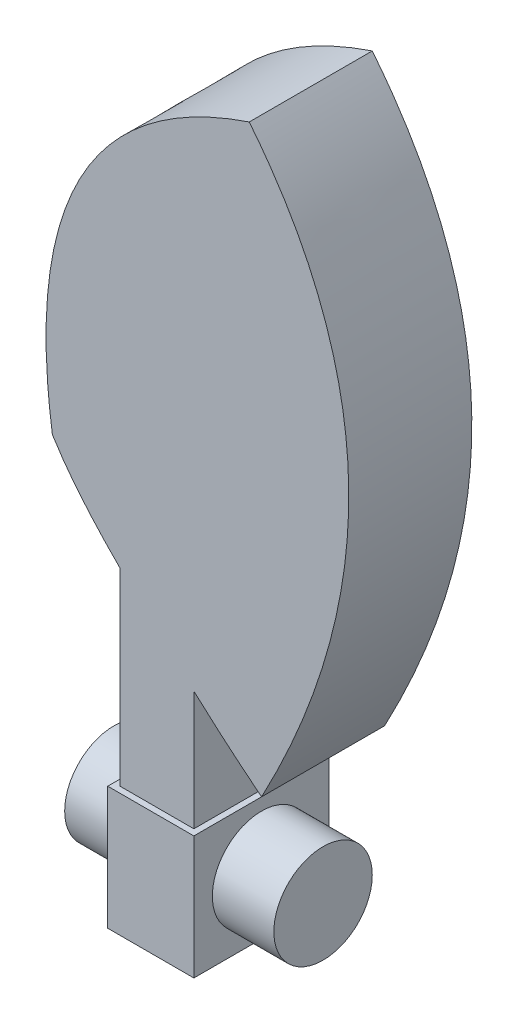
ISO-10303-21;
HEADER;
FILE_DESCRIPTION(('STEP AP214'),'2;1');
FILE_NAME('part.step','',(''),(''),'','','');
FILE_SCHEMA(('AUTOMOTIVE_DESIGN { 1 0 10303 214 1 1 1 1 }'));
ENDSEC;
DATA;
#1=APPLICATION_CONTEXT('core data for automotive mechanical design processes');
#2=APPLICATION_PROTOCOL_DEFINITION('international standard','automotive_design',2000,#1);
#3=PRODUCT_CONTEXT('',#1,'mechanical');
#4=PRODUCT('Part','Part','',(#3));
#5=PRODUCT_RELATED_PRODUCT_CATEGORY('part','',(#4));
#6=PRODUCT_DEFINITION_FORMATION('','',#4);
#7=PRODUCT_DEFINITION_CONTEXT('part definition',#1,'design');
#8=PRODUCT_DEFINITION('design','',#6,#7);
#9=PRODUCT_DEFINITION_SHAPE('','',#8);
#10=(LENGTH_UNIT() NAMED_UNIT(*) SI_UNIT(.MILLI.,.METRE.));
#11=(NAMED_UNIT(*) PLANE_ANGLE_UNIT() SI_UNIT($,.RADIAN.));
#12=(NAMED_UNIT(*) SI_UNIT($,.STERADIAN.) SOLID_ANGLE_UNIT());
#13=UNCERTAINTY_MEASURE_WITH_UNIT(LENGTH_MEASURE(1.E-05),#10,'distance_accuracy_value','');
#14=(GEOMETRIC_REPRESENTATION_CONTEXT(3) GLOBAL_UNCERTAINTY_ASSIGNED_CONTEXT((#13)) GLOBAL_UNIT_ASSIGNED_CONTEXT((#10,
#11,#12)) REPRESENTATION_CONTEXT('',''));
#15=CARTESIAN_POINT('',(0.,0.,0.));
#16=DIRECTION('',(0.,0.,1.));
#17=DIRECTION('',(1.,0.,0.));
#18=AXIS2_PLACEMENT_3D('',#15,#16,#17);
#19=CARTESIAN_POINT('',(0.,-22.,0.));
#20=DIRECTION('',(0.,1.,0.));
#21=DIRECTION('',(0.,0.,1.));
#22=AXIS2_PLACEMENT_3D('',#19,#20,#21);
#23=PLANE('',#22);
#24=DIRECTION('',(0.,0.,1.));
#25=VECTOR('',#24,1.);
#26=CARTESIAN_POINT('',(5.,-22.,10.5));
#27=LINE('',#26,#25);
#28=CARTESIAN_POINT('',(5.,-22.,-0.500000000000001));
#29=VERTEX_POINT('',#28);
#30=CARTESIAN_POINT('',(5.,-22.,10.5));
#31=VERTEX_POINT('',#30);
#32=EDGE_CURVE('E112',#29,#31,#27,.T.);
#33=ORIENTED_EDGE('',*,*,#32,.T.);
#34=DIRECTION('',(1.,0.,0.));
#35=VECTOR('',#34,1.);
#36=CARTESIAN_POINT('',(5.,-22.,10.5));
#37=LINE('',#36,#35);
#38=CARTESIAN_POINT('',(11.9999999936919,-22.,10.5));
#39=VERTEX_POINT('',#38);
#40=EDGE_CURVE('E82',#31,#39,#37,.T.);
#41=ORIENTED_EDGE('',*,*,#40,.T.);
#42=DIRECTION('',(0.,0.,-1.));
#43=VECTOR('',#42,1.);
#44=CARTESIAN_POINT('',(11.9999999936919,-22.,10.5));
#45=LINE('',#44,#43);
#46=CARTESIAN_POINT('',(11.9999999936919,-22.,-0.5));
#47=VERTEX_POINT('',#46);
#48=EDGE_CURVE('E120',#39,#47,#45,.T.);
#49=ORIENTED_EDGE('',*,*,#48,.T.);
#50=DIRECTION('',(-1.,0.,0.));
#51=VECTOR('',#50,1.);
#52=CARTESIAN_POINT('',(5.,-22.,-0.500000000000001));
#53=LINE('',#52,#51);
#54=EDGE_CURVE('E106',#47,#29,#53,.T.);
#55=ORIENTED_EDGE('',*,*,#54,.T.);
#56=EDGE_LOOP('',(#33,#41,#49,#55));
#57=FACE_BOUND('',#56,.T.);
#58=ADVANCED_FACE('F50',(#57),#23,.T.);
#59=CARTESIAN_POINT('',(0.,-27.,5.));
#60=DIRECTION('',(-1.,0.,0.));
#61=DIRECTION('',(0.,0.,1.));
#62=AXIS2_PLACEMENT_3D('',#59,#60,#61);
#63=PLANE('',#62);
#64=CARTESIAN_POINT('',(0.,-27.,5.));
#65=DIRECTION('',(-1.,0.,0.));
#66=DIRECTION('',(0.,0.,1.));
#67=AXIS2_PLACEMENT_3D('',#64,#65,#66);
#68=CIRCLE('',#67,4.);
#69=CARTESIAN_POINT('',(0.,-27.,9.));
#70=VERTEX_POINT('',#69);
#71=EDGE_CURVE('E13',#70,#70,#68,.T.);
#72=ORIENTED_EDGE('',*,*,#71,.T.);
#73=EDGE_LOOP('',(#72));
#74=FACE_BOUND('',#73,.T.);
#75=ADVANCED_FACE('F141',(#74),#63,.T.);
#76=CARTESIAN_POINT('',(16.9999999936919,-27.,5.));
#77=DIRECTION('',(1.,0.,0.));
#78=DIRECTION('',(0.,0.,-1.));
#79=AXIS2_PLACEMENT_3D('',#76,#77,#78);
#80=PLANE('',#79);
#81=CARTESIAN_POINT('',(16.9999999936919,-27.,5.));
#82=DIRECTION('',(1.,0.,0.));
#83=DIRECTION('',(0.,0.,-1.));
#84=AXIS2_PLACEMENT_3D('',#81,#82,#83);
#85=CIRCLE('',#84,4.);
#86=CARTESIAN_POINT('',(16.9999999936919,-27.,1.));
#87=VERTEX_POINT('',#86);
#88=EDGE_CURVE('E58',#87,#87,#85,.T.);
#89=ORIENTED_EDGE('',*,*,#88,.T.);
#90=EDGE_LOOP('',(#89));
#91=FACE_BOUND('',#90,.T.);
#92=ADVANCED_FACE('F145',(#91),#80,.T.);
#93=CARTESIAN_POINT('',(0.,-27.,5.));
#94=DIRECTION('',(1.,0.,0.));
#95=DIRECTION('',(0.,0.,-1.));
#96=AXIS2_PLACEMENT_3D('',#93,#94,#95);
#97=CYLINDRICAL_SURFACE('',#96,4.);
#98=ORIENTED_EDGE('',*,*,#71,.F.);
#99=EDGE_LOOP('',(#98));
#100=FACE_BOUND('',#99,.T.);
#101=CARTESIAN_POINT('',(5.,-27.,5.));
#102=DIRECTION('',(-1.,0.,0.));
#103=DIRECTION('',(0.,0.,1.));
#104=AXIS2_PLACEMENT_3D('',#101,#102,#103);
#105=CIRCLE('',#104,4.);
#106=CARTESIAN_POINT('',(5.,-27.,9.));
#107=VERTEX_POINT('',#106);
#108=EDGE_CURVE('E127',#107,#107,#105,.T.);
#109=ORIENTED_EDGE('',*,*,#108,.T.);
#110=EDGE_LOOP('',(#109));
#111=FACE_BOUND('',#110,.T.);
#112=ADVANCED_FACE('F132',(#100,#111),#97,.T.);
#113=CARTESIAN_POINT('',(5.,-22.,10.5));
#114=DIRECTION('',(0.,0.,-1.));
#115=DIRECTION('',(-1.,0.,0.));
#116=AXIS2_PLACEMENT_3D('',#113,#114,#115);
#117=PLANE('',#116);
#118=DIRECTION('',(1.,0.,0.));
#119=VECTOR('',#118,1.);
#120=CARTESIAN_POINT('',(5.,-32.,10.5));
#121=LINE('',#120,#119);
#122=CARTESIAN_POINT('',(5.,-32.,10.5));
#123=VERTEX_POINT('',#122);
#124=CARTESIAN_POINT('',(11.9999999936919,-32.,10.5));
#125=VERTEX_POINT('',#124);
#126=EDGE_CURVE('E66',#123,#125,#121,.T.);
#127=ORIENTED_EDGE('',*,*,#126,.T.);
#128=DIRECTION('',(0.,-1.,0.));
#129=VECTOR('',#128,1.);
#130=CARTESIAN_POINT('',(11.9999999936919,-22.,10.5));
#131=LINE('',#130,#129);
#132=EDGE_CURVE('E103',#39,#125,#131,.T.);
#133=ORIENTED_EDGE('',*,*,#132,.F.);
#134=ORIENTED_EDGE('',*,*,#40,.F.);
#135=DIRECTION('',(0.,-1.,0.));
#136=VECTOR('',#135,1.);
#137=CARTESIAN_POINT('',(5.,-22.,10.5));
#138=LINE('',#137,#136);
#139=EDGE_CURVE('E126',#31,#123,#138,.T.);
#140=ORIENTED_EDGE('',*,*,#139,.T.);
#141=EDGE_LOOP('',(#127,#133,#134,#140));
#142=FACE_BOUND('',#141,.T.);
#143=ADVANCED_FACE('F159',(#142),#117,.F.);
#144=CARTESIAN_POINT('',(16.9999999936919,-27.,5.));
#145=DIRECTION('',(-1.,0.,0.));
#146=DIRECTION('',(0.,0.,1.));
#147=AXIS2_PLACEMENT_3D('',#144,#145,#146);
#148=CYLINDRICAL_SURFACE('',#147,4.);
#149=ORIENTED_EDGE('',*,*,#88,.F.);
#150=EDGE_LOOP('',(#149));
#151=FACE_BOUND('',#150,.T.);
#152=CARTESIAN_POINT('',(11.9999999936919,-27.,5.));
#153=DIRECTION('',(1.,0.,0.));
#154=DIRECTION('',(0.,0.,-1.));
#155=AXIS2_PLACEMENT_3D('',#152,#153,#154);
#156=CIRCLE('',#155,4.);
#157=CARTESIAN_POINT('',(11.9999999936919,-27.,1.));
#158=VERTEX_POINT('',#157);
#159=EDGE_CURVE('E123',#158,#158,#156,.T.);
#160=ORIENTED_EDGE('',*,*,#159,.T.);
#161=EDGE_LOOP('',(#160));
#162=FACE_BOUND('',#161,.T.);
#163=ADVANCED_FACE('F156',(#151,#162),#148,.T.);
#164=CARTESIAN_POINT('',(11.9999999936919,-22.,10.5));
#165=DIRECTION('',(-1.,0.,0.));
#166=DIRECTION('',(0.,0.,1.));
#167=AXIS2_PLACEMENT_3D('',#164,#165,#166);
#168=PLANE('',#167);
#169=ORIENTED_EDGE('',*,*,#159,.F.);
#170=EDGE_LOOP('',(#169));
#171=FACE_BOUND('',#170,.T.);
#172=DIRECTION('',(0.,0.,-1.));
#173=VECTOR('',#172,1.);
#174=CARTESIAN_POINT('',(11.9999999936919,-32.,10.5));
#175=LINE('',#174,#173);
#176=CARTESIAN_POINT('',(11.9999999936919,-32.,-0.5));
#177=VERTEX_POINT('',#176);
#178=EDGE_CURVE('E98',#125,#177,#175,.T.);
#179=ORIENTED_EDGE('',*,*,#178,.T.);
#180=DIRECTION('',(0.,-1.,0.));
#181=VECTOR('',#180,1.);
#182=CARTESIAN_POINT('',(11.9999999936919,-22.,-0.5));
#183=LINE('',#182,#181);
#184=EDGE_CURVE('E101',#47,#177,#183,.T.);
#185=ORIENTED_EDGE('',*,*,#184,.F.);
#186=ORIENTED_EDGE('',*,*,#48,.F.);
#187=ORIENTED_EDGE('',*,*,#132,.T.);
#188=EDGE_LOOP('',(#179,#185,#186,#187));
#189=FACE_BOUND('',#188,.T.);
#190=ADVANCED_FACE('F99',(#171,#189),#168,.F.);
#191=CARTESIAN_POINT('',(5.,-22.,10.5));
#192=DIRECTION('',(1.,0.,0.));
#193=DIRECTION('',(0.,0.,-1.));
#194=AXIS2_PLACEMENT_3D('',#191,#192,#193);
#195=PLANE('',#194);
#196=ORIENTED_EDGE('',*,*,#108,.F.);
#197=EDGE_LOOP('',(#196));
#198=FACE_BOUND('',#197,.T.);
#199=DIRECTION('',(0.,0.,1.));
#200=VECTOR('',#199,1.);
#201=CARTESIAN_POINT('',(5.,-32.,10.5));
#202=LINE('',#201,#200);
#203=CARTESIAN_POINT('',(5.,-32.,-0.500000000000001));
#204=VERTEX_POINT('',#203);
#205=EDGE_CURVE('E111',#204,#123,#202,.T.);
#206=ORIENTED_EDGE('',*,*,#205,.T.);
#207=ORIENTED_EDGE('',*,*,#139,.F.);
#208=ORIENTED_EDGE('',*,*,#32,.F.);
#209=DIRECTION('',(0.,-1.,0.));
#210=VECTOR('',#209,1.);
#211=CARTESIAN_POINT('',(5.,-22.,-0.500000000000001));
#212=LINE('',#211,#210);
#213=EDGE_CURVE('E107',#29,#204,#212,.T.);
#214=ORIENTED_EDGE('',*,*,#213,.T.);
#215=EDGE_LOOP('',(#206,#207,#208,#214));
#216=FACE_BOUND('',#215,.T.);
#217=ADVANCED_FACE('F134',(#198,#216),#195,.F.);
#218=CARTESIAN_POINT('',(0.,-32.,0.));
#219=DIRECTION('',(0.,1.,0.));
#220=DIRECTION('',(0.,0.,1.));
#221=AXIS2_PLACEMENT_3D('',#218,#219,#220);
#222=PLANE('',#221);
#223=ORIENTED_EDGE('',*,*,#205,.F.);
#224=DIRECTION('',(-1.,0.,0.));
#225=VECTOR('',#224,1.);
#226=CARTESIAN_POINT('',(5.,-32.,-0.500000000000001));
#227=LINE('',#226,#225);
#228=EDGE_CURVE('E92',#177,#204,#227,.T.);
#229=ORIENTED_EDGE('',*,*,#228,.F.);
#230=ORIENTED_EDGE('',*,*,#178,.F.);
#231=ORIENTED_EDGE('',*,*,#126,.F.);
#232=EDGE_LOOP('',(#223,#229,#230,#231));
#233=FACE_BOUND('',#232,.T.);
#234=ADVANCED_FACE('F109',(#233),#222,.F.);
#235=CARTESIAN_POINT('',(5.,-22.,-0.500000000000001));
#236=DIRECTION('',(0.,0.,1.));
#237=DIRECTION('',(1.,0.,0.));
#238=AXIS2_PLACEMENT_3D('',#235,#236,#237);
#239=PLANE('',#238);
#240=ORIENTED_EDGE('',*,*,#228,.T.);
#241=ORIENTED_EDGE('',*,*,#213,.F.);
#242=ORIENTED_EDGE('',*,*,#54,.F.);
#243=ORIENTED_EDGE('',*,*,#184,.T.);
#244=EDGE_LOOP('',(#240,#241,#242,#243));
#245=FACE_BOUND('',#244,.T.);
#246=ADVANCED_FACE('F105',(#245),#239,.F.);
#247=CLOSED_SHELL('',(#58,#75,#92,#112,#143,#163,#190,#217,#234,#246));
#248=MANIFOLD_SOLID_BREP('B2',#247);
#249=CARTESIAN_POINT('',(0.,-22.,0.));
#250=DIRECTION('',(0.,1.,0.));
#251=DIRECTION('',(0.,0.,1.));
#252=AXIS2_PLACEMENT_3D('',#249,#250,#251);
#253=PLANE('',#252);
#254=DIRECTION('',(-1.,0.,0.));
#255=VECTOR('',#254,1.);
#256=CARTESIAN_POINT('',(8.00449296933353,-22.,10.));
#257=LINE('',#256,#255);
#258=CARTESIAN_POINT('',(11.5,-22.,10.));
#259=VERTEX_POINT('',#258);
#260=CARTESIAN_POINT('',(5.5,-22.,10.));
#261=VERTEX_POINT('',#260);
#262=EDGE_CURVE('E48',#259,#261,#257,.T.);
#263=ORIENTED_EDGE('',*,*,#262,.T.);
#264=DIRECTION('',(0.,0.,-1.));
#265=VECTOR('',#264,1.);
#266=CARTESIAN_POINT('',(5.5,-22.,0.));
#267=LINE('',#266,#265);
#268=CARTESIAN_POINT('',(5.5,-22.,0.));
#269=VERTEX_POINT('',#268);
#270=EDGE_CURVE('E249',#261,#269,#267,.T.);
#271=ORIENTED_EDGE('',*,*,#270,.T.);
#272=DIRECTION('',(-1.,0.,0.));
#273=VECTOR('',#272,1.);
#274=CARTESIAN_POINT('',(8.00449296933353,-22.,0.));
#275=LINE('',#274,#273);
#276=CARTESIAN_POINT('',(11.5,-22.,0.));
#277=VERTEX_POINT('',#276);
#278=EDGE_CURVE('E332',#277,#269,#275,.T.);
#279=ORIENTED_EDGE('',*,*,#278,.F.);
#280=DIRECTION('',(0.,0.,1.));
#281=VECTOR('',#280,1.);
#282=CARTESIAN_POINT('',(11.5,-22.,10.));
#283=LINE('',#282,#281);
#284=EDGE_CURVE('E243',#277,#259,#283,.T.);
#285=ORIENTED_EDGE('',*,*,#284,.T.);
#286=EDGE_LOOP('',(#263,#271,#279,#285));
#287=FACE_BOUND('',#286,.T.);
#288=ADVANCED_FACE('F240',(#287),#253,.F.);
#289=CARTESIAN_POINT('',(8.00449296933353,-9.06841862567567,10.));
#290=DIRECTION('',(0.,0.,-1.));
#291=DIRECTION('',(-1.,0.,0.));
#292=AXIS2_PLACEMENT_3D('',#289,#290,#291);
#293=PLANE('',#292);
#294=ORIENTED_EDGE('',*,*,#262,.F.);
#295=DIRECTION('',(0.,-1.,0.));
#296=VECTOR('',#295,1.);
#297=CARTESIAN_POINT('',(11.5,30.002,10.));
#298=LINE('',#297,#296);
#299=CARTESIAN_POINT('',(11.4999999936919,-12.3149878203846,10.));
#300=VERTEX_POINT('',#299);
#301=EDGE_CURVE('E325',#300,#259,#298,.T.);
#302=ORIENTED_EDGE('',*,*,#301,.F.);
#303=CARTESIAN_POINT('',(0.,0.,10.));
#304=CARTESIAN_POINT('',(2.28413121462226,-3.72979708437166,10.));
#305=CARTESIAN_POINT('',(8.77956172643109,-9.79248956683348,10.));
#306=CARTESIAN_POINT('',(13.5206506984055,-14.2233406533758,10.));
#307=CARTESIAN_POINT('',(17.,-17.,10.));
#308=B_SPLINE_CURVE_WITH_KNOTS('',3,(#303,#304,#305,#306,#307),.UNSPECIFIED.,.F.,.F.,(4,1,4),
(0.,0.559197283534878,1.),.UNSPECIFIED.);
#309=CARTESIAN_POINT('',(17.,-17.,10.));
#310=VERTEX_POINT('',#309);
#311=EDGE_CURVE('E316',#300,#310,#308,.T.);
#312=ORIENTED_EDGE('',*,*,#311,.T.);
#313=CARTESIAN_POINT('',(17.,-17.,10.));
#314=CARTESIAN_POINT('',(31.6648716567835,10.4933065026717,10.));
#315=CARTESIAN_POINT('',(16.,30.,10.));
#316=B_SPLINE_CURVE_WITH_KNOTS('',2,(#313,#314,#315),.UNSPECIFIED.,.F.,.F.,(3,3),(0.,1.),.UNSPECIFIED.);
#317=CARTESIAN_POINT('',(16.,30.,10.));
#318=VERTEX_POINT('',#317);
#319=EDGE_CURVE('E348',#310,#318,#316,.T.);
#320=ORIENTED_EDGE('',*,*,#319,.T.);
#321=CARTESIAN_POINT('',(16.,30.,10.));
#322=CARTESIAN_POINT('',(-3.41961041312225,23.4678898970782,10.));
#323=CARTESIAN_POINT('',(0.,0.,10.));
#324=B_SPLINE_CURVE_WITH_KNOTS('',2,(#321,#322,#323),.UNSPECIFIED.,.F.,.F.,(3,3),(0.,1.),.UNSPECIFIED.);
#325=CARTESIAN_POINT('',(0.,0.,10.));
#326=VERTEX_POINT('',#325);
#327=EDGE_CURVE('E369',#318,#326,#324,.T.);
#328=ORIENTED_EDGE('',*,*,#327,.T.);
#329=CARTESIAN_POINT('',(5.49999999953762,-6.65440896450523,10.));
#330=VERTEX_POINT('',#329);
#331=EDGE_CURVE('E341',#326,#330,#308,.T.);
#332=ORIENTED_EDGE('',*,*,#331,.T.);
#333=DIRECTION('',(0.,-1.,0.));
#334=VECTOR('',#333,1.);
#335=CARTESIAN_POINT('',(5.5,30.002,10.));
#336=LINE('',#335,#334);
#337=EDGE_CURVE('E330',#330,#261,#336,.T.);
#338=ORIENTED_EDGE('',*,*,#337,.T.);
#339=EDGE_LOOP('',(#294,#302,#312,#320,#328,#332,#338));
#340=FACE_BOUND('',#339,.T.);
#341=ADVANCED_FACE('F416',(#340),#293,.F.);
#342=CARTESIAN_POINT('',(8.00449296933353,-9.06841862567567,0.));
#343=DIRECTION('',(0.,0.,-1.));
#344=DIRECTION('',(-1.,0.,0.));
#345=AXIS2_PLACEMENT_3D('',#342,#343,#344);
#346=PLANE('',#345);
#347=DIRECTION('',(0.,-1.,0.));
#348=VECTOR('',#347,1.);
#349=CARTESIAN_POINT('',(11.5,30.002,0.));
#350=LINE('',#349,#348);
#351=CARTESIAN_POINT('',(11.5,-12.3149878203846,0.));
#352=VERTEX_POINT('',#351);
#353=EDGE_CURVE('E304',#352,#277,#350,.T.);
#354=ORIENTED_EDGE('',*,*,#353,.T.);
#355=ORIENTED_EDGE('',*,*,#278,.T.);
#356=DIRECTION('',(0.,-1.,0.));
#357=VECTOR('',#356,1.);
#358=CARTESIAN_POINT('',(5.5,30.002,0.));
#359=LINE('',#358,#357);
#360=CARTESIAN_POINT('',(5.49999999953762,-6.65440896450523,0.));
#361=VERTEX_POINT('',#360);
#362=EDGE_CURVE('E326',#361,#269,#359,.T.);
#363=ORIENTED_EDGE('',*,*,#362,.F.);
#364=CARTESIAN_POINT('',(0.,0.,0.));
#365=CARTESIAN_POINT('',(2.28413121462226,-3.72979708437166,0.));
#366=CARTESIAN_POINT('',(8.77956172643109,-9.79248956683348,0.));
#367=CARTESIAN_POINT('',(13.5206506984055,-14.2233406533758,0.));
#368=CARTESIAN_POINT('',(17.,-17.,0.));
#369=B_SPLINE_CURVE_WITH_KNOTS('',3,(#364,#365,#366,#367,#368),.UNSPECIFIED.,.F.,.F.,(4,1,4),
(0.,0.559197283534878,1.),.UNSPECIFIED.);
#370=CARTESIAN_POINT('',(0.,0.,0.));
#371=VERTEX_POINT('',#370);
#372=EDGE_CURVE('E311',#371,#361,#369,.T.);
#373=ORIENTED_EDGE('',*,*,#372,.F.);
#374=CARTESIAN_POINT('',(16.,30.,0.));
#375=CARTESIAN_POINT('',(-3.41961041312225,23.4678898970782,0.));
#376=CARTESIAN_POINT('',(0.,0.,0.));
#377=B_SPLINE_CURVE_WITH_KNOTS('',2,(#374,#375,#376),.UNSPECIFIED.,.F.,.F.,(3,3),(0.,1.),.UNSPECIFIED.);
#378=CARTESIAN_POINT('',(16.,30.,0.));
#379=VERTEX_POINT('',#378);
#380=EDGE_CURVE('E389',#379,#371,#377,.T.);
#381=ORIENTED_EDGE('',*,*,#380,.F.);
#382=CARTESIAN_POINT('',(17.,-17.,0.));
#383=CARTESIAN_POINT('',(31.6648716567835,10.4933065026717,0.));
#384=CARTESIAN_POINT('',(16.,30.,0.));
#385=B_SPLINE_CURVE_WITH_KNOTS('',2,(#382,#383,#384),.UNSPECIFIED.,.F.,.F.,(3,3),(0.,1.),.UNSPECIFIED.);
#386=CARTESIAN_POINT('',(17.,-17.,0.));
#387=VERTEX_POINT('',#386);
#388=EDGE_CURVE('E306',#387,#379,#385,.T.);
#389=ORIENTED_EDGE('',*,*,#388,.F.);
#390=EDGE_CURVE('E300',#352,#387,#369,.T.);
#391=ORIENTED_EDGE('',*,*,#390,.F.);
#392=EDGE_LOOP('',(#354,#355,#363,#373,#381,#389,#391));
#393=FACE_BOUND('',#392,.T.);
#394=ADVANCED_FACE('F302',(#393),#346,.T.);
#395=CARTESIAN_POINT('',(5.5,30.002,0.));
#396=DIRECTION('',(1.,0.,0.));
#397=DIRECTION('',(0.,0.,-1.));
#398=AXIS2_PLACEMENT_3D('',#395,#396,#397);
#399=PLANE('',#398);
#400=ORIENTED_EDGE('',*,*,#270,.F.);
#401=ORIENTED_EDGE('',*,*,#337,.F.);
#402=DIRECTION('',(0.,0.,-1.));
#403=VECTOR('',#402,1.);
#404=CARTESIAN_POINT('',(5.5,-6.65440896496731,10.));
#405=LINE('',#404,#403);
#406=EDGE_CURVE('E321',#361,#330,#405,.F.);
#407=ORIENTED_EDGE('',*,*,#406,.F.);
#408=ORIENTED_EDGE('',*,*,#362,.T.);
#409=EDGE_LOOP('',(#400,#401,#407,#408));
#410=FACE_BOUND('',#409,.T.);
#411=ADVANCED_FACE('F424',(#410),#399,.F.);
#412=CARTESIAN_POINT('',(11.5,30.002,10.));
#413=DIRECTION('',(-1.,0.,0.));
#414=DIRECTION('',(0.,0.,1.));
#415=AXIS2_PLACEMENT_3D('',#412,#413,#414);
#416=PLANE('',#415);
#417=ORIENTED_EDGE('',*,*,#284,.F.);
#418=ORIENTED_EDGE('',*,*,#353,.F.);
#419=DIRECTION('',(0.,0.,-1.));
#420=VECTOR('',#419,1.);
#421=CARTESIAN_POINT('',(11.5,-12.3149878261257,10.));
#422=LINE('',#421,#420);
#423=EDGE_CURVE('E312',#300,#352,#422,.T.);
#424=ORIENTED_EDGE('',*,*,#423,.F.);
#425=ORIENTED_EDGE('',*,*,#301,.T.);
#426=EDGE_LOOP('',(#417,#418,#424,#425));
#427=FACE_BOUND('',#426,.T.);
#428=ADVANCED_FACE('F323',(#427),#416,.F.);
#429=DIRECTION('',(0.,0.,-1.));
#430=VECTOR('',#429,1.);
#431=SURFACE_OF_LINEAR_EXTRUSION('',#308,#430);
#432=ORIENTED_EDGE('',*,*,#406,.T.);
#433=ORIENTED_EDGE('',*,*,#331,.F.);
#434=DIRECTION('',(0.,0.,-1.));
#435=VECTOR('',#434,1.);
#436=CARTESIAN_POINT('',(0.,0.,10.));
#437=LINE('',#436,#435);
#438=EDGE_CURVE('E374',#326,#371,#437,.T.);
#439=ORIENTED_EDGE('',*,*,#438,.T.);
#440=ORIENTED_EDGE('',*,*,#372,.T.);
#441=EDGE_LOOP('',(#432,#433,#439,#440));
#442=FACE_BOUND('',#441,.T.);
#443=ADVANCED_FACE('F356',(#442),#431,.F.);
#444=ORIENTED_EDGE('',*,*,#423,.T.);
#445=ORIENTED_EDGE('',*,*,#390,.T.);
#446=DIRECTION('',(0.,0.,-1.));
#447=VECTOR('',#446,1.);
#448=CARTESIAN_POINT('',(17.,-17.,10.));
#449=LINE('',#448,#447);
#450=EDGE_CURVE('E406',#310,#387,#449,.T.);
#451=ORIENTED_EDGE('',*,*,#450,.F.);
#452=ORIENTED_EDGE('',*,*,#311,.F.);
#453=EDGE_LOOP('',(#444,#445,#451,#452));
#454=FACE_BOUND('',#453,.T.);
#455=ADVANCED_FACE('F315',(#454),#431,.F.);
#456=DIRECTION('',(0.,0.,-1.));
#457=VECTOR('',#456,1.);
#458=SURFACE_OF_LINEAR_EXTRUSION('',#316,#457);
#459=ORIENTED_EDGE('',*,*,#388,.T.);
#460=DIRECTION('',(0.,0.,-1.));
#461=VECTOR('',#460,1.);
#462=CARTESIAN_POINT('',(16.,30.,10.));
#463=LINE('',#462,#461);
#464=EDGE_CURVE('E403',#318,#379,#463,.T.);
#465=ORIENTED_EDGE('',*,*,#464,.F.);
#466=ORIENTED_EDGE('',*,*,#319,.F.);
#467=ORIENTED_EDGE('',*,*,#450,.T.);
#468=EDGE_LOOP('',(#459,#465,#466,#467));
#469=FACE_BOUND('',#468,.T.);
#470=ADVANCED_FACE('F360',(#469),#458,.F.);
#471=DIRECTION('',(0.,0.,-1.));
#472=VECTOR('',#471,1.);
#473=SURFACE_OF_LINEAR_EXTRUSION('',#324,#472);
#474=ORIENTED_EDGE('',*,*,#380,.T.);
#475=ORIENTED_EDGE('',*,*,#438,.F.);
#476=ORIENTED_EDGE('',*,*,#327,.F.);
#477=ORIENTED_EDGE('',*,*,#464,.T.);
#478=EDGE_LOOP('',(#474,#475,#476,#477));
#479=FACE_BOUND('',#478,.T.);
#480=ADVANCED_FACE('F363',(#479),#473,.F.);
#481=CLOSED_SHELL('',(#288,#341,#394,#411,#428,#443,#455,#470,#480));
#482=MANIFOLD_SOLID_BREP('B7',#481);
#483=ADVANCED_BREP_SHAPE_REPRESENTATION('',(#18,#248,#482),#14);
#484=SHAPE_DEFINITION_REPRESENTATION(#9,#483);
ENDSEC;
END-ISO-10303-21;
